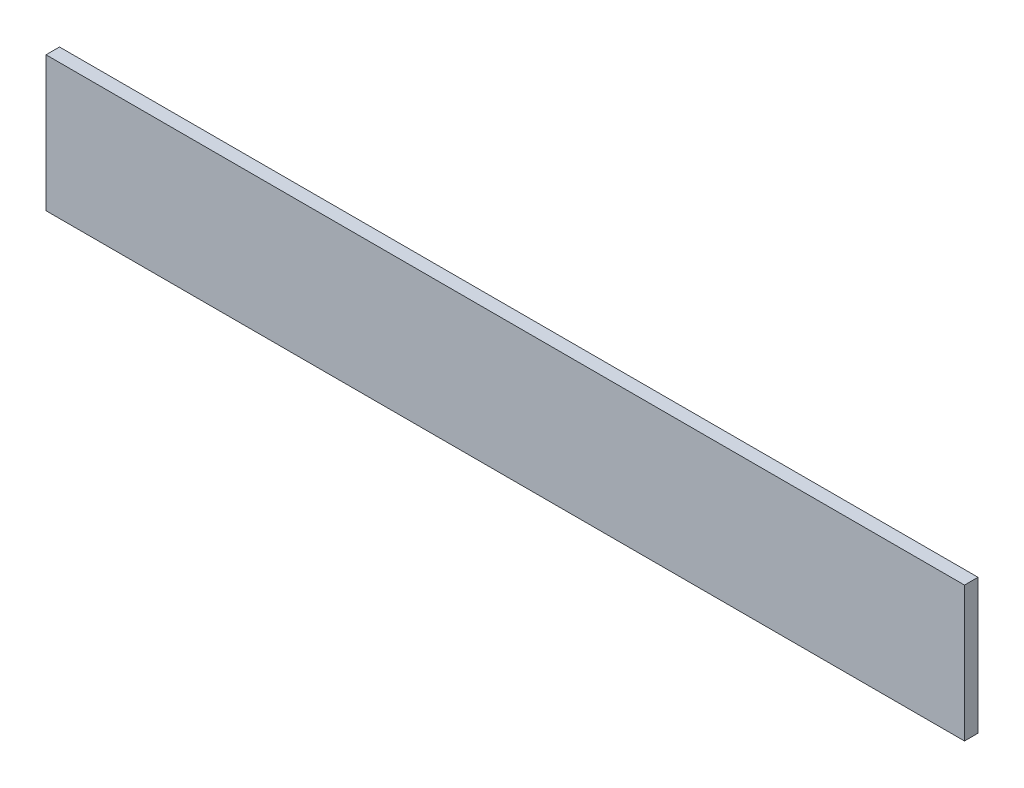
ISO-10303-21;
HEADER;
FILE_DESCRIPTION(('STEP AP214'),'2;1');
FILE_NAME('part.step','',(''),(''),'','','');
FILE_SCHEMA(('AUTOMOTIVE_DESIGN { 1 0 10303 214 1 1 1 1 }'));
ENDSEC;
DATA;
#1=APPLICATION_CONTEXT('core data for automotive mechanical design processes');
#2=APPLICATION_PROTOCOL_DEFINITION('international standard','automotive_design',2000,#1);
#3=PRODUCT_CONTEXT('',#1,'mechanical');
#4=PRODUCT('Part','Part','',(#3));
#5=PRODUCT_RELATED_PRODUCT_CATEGORY('part','',(#4));
#6=PRODUCT_DEFINITION_FORMATION('','',#4);
#7=PRODUCT_DEFINITION_CONTEXT('part definition',#1,'design');
#8=PRODUCT_DEFINITION('design','',#6,#7);
#9=PRODUCT_DEFINITION_SHAPE('','',#8);
#10=(LENGTH_UNIT() NAMED_UNIT(*) SI_UNIT(.MILLI.,.METRE.));
#11=(NAMED_UNIT(*) PLANE_ANGLE_UNIT() SI_UNIT($,.RADIAN.));
#12=(NAMED_UNIT(*) SI_UNIT($,.STERADIAN.) SOLID_ANGLE_UNIT());
#13=UNCERTAINTY_MEASURE_WITH_UNIT(LENGTH_MEASURE(1.E-05),#10,'distance_accuracy_value','');
#14=(GEOMETRIC_REPRESENTATION_CONTEXT(3) GLOBAL_UNCERTAINTY_ASSIGNED_CONTEXT((#13)) GLOBAL_UNIT_ASSIGNED_CONTEXT((#10,
#11,#12)) REPRESENTATION_CONTEXT('',''));
#15=CARTESIAN_POINT('',(0.,0.,0.));
#16=DIRECTION('',(0.,0.,1.));
#17=DIRECTION('',(1.,0.,0.));
#18=AXIS2_PLACEMENT_3D('',#15,#16,#17);
#19=CARTESIAN_POINT('',(0.,0.,10.));
#20=DIRECTION('',(-1.,0.,0.));
#21=DIRECTION('',(0.,-1.,0.));
#22=AXIS2_PLACEMENT_3D('',#19,#20,#21);
#23=PLANE('',#22);
#24=DIRECTION('',(0.,1.,0.));
#25=VECTOR('',#24,1.);
#26=CARTESIAN_POINT('',(0.,0.,0.));
#27=LINE('',#26,#25);
#28=CARTESIAN_POINT('',(0.,0.,0.));
#29=VERTEX_POINT('',#28);
#30=CARTESIAN_POINT('',(0.,100.,0.));
#31=VERTEX_POINT('',#30);
#32=EDGE_CURVE('E96',#29,#31,#27,.T.);
#33=ORIENTED_EDGE('',*,*,#32,.T.);
#34=DIRECTION('',(0.,0.,-1.));
#35=VECTOR('',#34,1.);
#36=CARTESIAN_POINT('',(0.,100.,10.));
#37=LINE('',#36,#35);
#38=CARTESIAN_POINT('',(0.,100.,10.));
#39=VERTEX_POINT('',#38);
#40=EDGE_CURVE('E11',#39,#31,#37,.T.);
#41=ORIENTED_EDGE('',*,*,#40,.F.);
#42=DIRECTION('',(0.,1.,0.));
#43=VECTOR('',#42,1.);
#44=CARTESIAN_POINT('',(0.,0.,10.));
#45=LINE('',#44,#43);
#46=CARTESIAN_POINT('',(0.,0.,10.));
#47=VERTEX_POINT('',#46);
#48=EDGE_CURVE('E84',#47,#39,#45,.T.);
#49=ORIENTED_EDGE('',*,*,#48,.F.);
#50=DIRECTION('',(0.,0.,-1.));
#51=VECTOR('',#50,1.);
#52=CARTESIAN_POINT('',(0.,0.,10.));
#53=LINE('',#52,#51);
#54=EDGE_CURVE('E92',#47,#29,#53,.T.);
#55=ORIENTED_EDGE('',*,*,#54,.T.);
#56=EDGE_LOOP('',(#33,#41,#49,#55));
#57=FACE_BOUND('',#56,.T.);
#58=ADVANCED_FACE('F33',(#57),#23,.F.);
#59=CARTESIAN_POINT('',(0.,100.,10.));
#60=DIRECTION('',(0.,-1.,0.));
#61=DIRECTION('',(1.,0.,0.));
#62=AXIS2_PLACEMENT_3D('',#59,#60,#61);
#63=PLANE('',#62);
#64=DIRECTION('',(-1.,0.,0.));
#65=VECTOR('',#64,1.);
#66=CARTESIAN_POINT('',(0.,100.,0.));
#67=LINE('',#66,#65);
#68=CARTESIAN_POINT('',(-680.,100.,0.));
#69=VERTEX_POINT('',#68);
#70=EDGE_CURVE('E88',#31,#69,#67,.T.);
#71=ORIENTED_EDGE('',*,*,#70,.T.);
#72=DIRECTION('',(0.,0.,-1.));
#73=VECTOR('',#72,1.);
#74=CARTESIAN_POINT('',(-680.,100.,10.));
#75=LINE('',#74,#73);
#76=CARTESIAN_POINT('',(-680.,100.,10.));
#77=VERTEX_POINT('',#76);
#78=EDGE_CURVE('E41',#77,#69,#75,.T.);
#79=ORIENTED_EDGE('',*,*,#78,.F.);
#80=DIRECTION('',(-1.,0.,0.));
#81=VECTOR('',#80,1.);
#82=CARTESIAN_POINT('',(0.,100.,10.));
#83=LINE('',#82,#81);
#84=EDGE_CURVE('E79',#39,#77,#83,.T.);
#85=ORIENTED_EDGE('',*,*,#84,.F.);
#86=ORIENTED_EDGE('',*,*,#40,.T.);
#87=EDGE_LOOP('',(#71,#79,#85,#86));
#88=FACE_BOUND('',#87,.T.);
#89=ADVANCED_FACE('F87',(#88),#63,.F.);
#90=CARTESIAN_POINT('',(-680.,0.,10.));
#91=DIRECTION('',(1.,0.,0.));
#92=DIRECTION('',(0.,0.,-1.));
#93=AXIS2_PLACEMENT_3D('',#90,#91,#92);
#94=PLANE('',#93);
#95=DIRECTION('',(0.,-1.,0.));
#96=VECTOR('',#95,1.);
#97=CARTESIAN_POINT('',(-680.,0.,0.));
#98=LINE('',#97,#96);
#99=CARTESIAN_POINT('',(-680.,0.,0.));
#100=VERTEX_POINT('',#99);
#101=EDGE_CURVE('E66',#69,#100,#98,.T.);
#102=ORIENTED_EDGE('',*,*,#101,.T.);
#103=DIRECTION('',(0.,0.,-1.));
#104=VECTOR('',#103,1.);
#105=CARTESIAN_POINT('',(-680.,0.,10.));
#106=LINE('',#105,#104);
#107=CARTESIAN_POINT('',(-680.,0.,10.));
#108=VERTEX_POINT('',#107);
#109=EDGE_CURVE('E89',#108,#100,#106,.T.);
#110=ORIENTED_EDGE('',*,*,#109,.F.);
#111=DIRECTION('',(0.,-1.,0.));
#112=VECTOR('',#111,1.);
#113=CARTESIAN_POINT('',(-680.,0.,10.));
#114=LINE('',#113,#112);
#115=EDGE_CURVE('E82',#77,#108,#114,.T.);
#116=ORIENTED_EDGE('',*,*,#115,.F.);
#117=ORIENTED_EDGE('',*,*,#78,.T.);
#118=EDGE_LOOP('',(#102,#110,#116,#117));
#119=FACE_BOUND('',#118,.T.);
#120=ADVANCED_FACE('F90',(#119),#94,.F.);
#121=CARTESIAN_POINT('',(0.,0.,10.));
#122=DIRECTION('',(0.,1.,0.));
#123=DIRECTION('',(-1.,0.,0.));
#124=AXIS2_PLACEMENT_3D('',#121,#122,#123);
#125=PLANE('',#124);
#126=DIRECTION('',(1.,0.,0.));
#127=VECTOR('',#126,1.);
#128=CARTESIAN_POINT('',(0.,0.,0.));
#129=LINE('',#128,#127);
#130=EDGE_CURVE('E72',#100,#29,#129,.T.);
#131=ORIENTED_EDGE('',*,*,#130,.T.);
#132=ORIENTED_EDGE('',*,*,#54,.F.);
#133=DIRECTION('',(1.,0.,0.));
#134=VECTOR('',#133,1.);
#135=CARTESIAN_POINT('',(0.,0.,10.));
#136=LINE('',#135,#134);
#137=EDGE_CURVE('E49',#108,#47,#136,.T.);
#138=ORIENTED_EDGE('',*,*,#137,.F.);
#139=ORIENTED_EDGE('',*,*,#109,.T.);
#140=EDGE_LOOP('',(#131,#132,#138,#139));
#141=FACE_BOUND('',#140,.T.);
#142=ADVANCED_FACE('F103',(#141),#125,.F.);
#143=CARTESIAN_POINT('',(0.,0.,10.));
#144=DIRECTION('',(0.,0.,1.));
#145=DIRECTION('',(1.,0.,0.));
#146=AXIS2_PLACEMENT_3D('',#143,#144,#145);
#147=PLANE('',#146);
#148=ORIENTED_EDGE('',*,*,#48,.T.);
#149=ORIENTED_EDGE('',*,*,#84,.T.);
#150=ORIENTED_EDGE('',*,*,#115,.T.);
#151=ORIENTED_EDGE('',*,*,#137,.T.);
#152=EDGE_LOOP('',(#148,#149,#150,#151));
#153=FACE_BOUND('',#152,.T.);
#154=ADVANCED_FACE('F80',(#153),#147,.T.);
#155=CARTESIAN_POINT('',(0.,0.,0.));
#156=DIRECTION('',(0.,0.,1.));
#157=DIRECTION('',(1.,0.,0.));
#158=AXIS2_PLACEMENT_3D('',#155,#156,#157);
#159=PLANE('',#158);
#160=ORIENTED_EDGE('',*,*,#32,.F.);
#161=ORIENTED_EDGE('',*,*,#130,.F.);
#162=ORIENTED_EDGE('',*,*,#101,.F.);
#163=ORIENTED_EDGE('',*,*,#70,.F.);
#164=EDGE_LOOP('',(#160,#161,#162,#163));
#165=FACE_BOUND('',#164,.T.);
#166=ADVANCED_FACE('F106',(#165),#159,.F.);
#167=CLOSED_SHELL('',(#58,#89,#120,#142,#154,#166));
#168=MANIFOLD_SOLID_BREP('B2',#167);
#169=ADVANCED_BREP_SHAPE_REPRESENTATION('',(#18,#168),#14);
#170=SHAPE_DEFINITION_REPRESENTATION(#9,#169);
ENDSEC;
END-ISO-10303-21;
